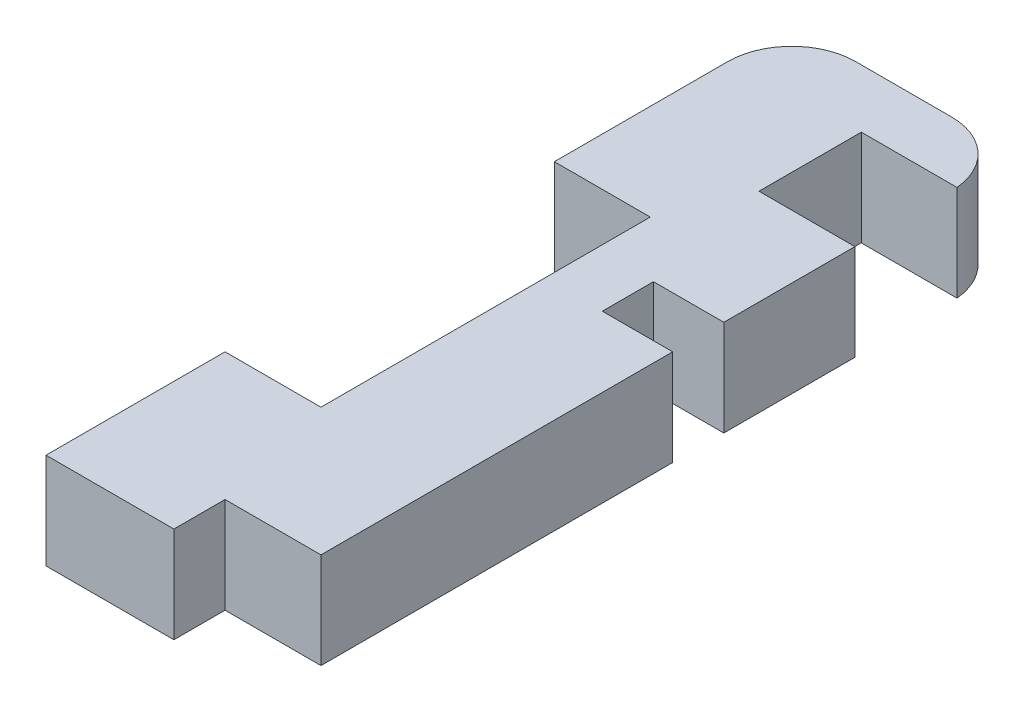
ISO-10303-21;
HEADER;
FILE_DESCRIPTION(('STEP AP214'),'2;1');
FILE_NAME('part.step','',(''),(''),'','','');
FILE_SCHEMA(('AUTOMOTIVE_DESIGN { 1 0 10303 214 1 1 1 1 }'));
ENDSEC;
DATA;
#1=APPLICATION_CONTEXT('core data for automotive mechanical design processes');
#2=APPLICATION_PROTOCOL_DEFINITION('international standard','automotive_design',2000,#1);
#3=PRODUCT_CONTEXT('',#1,'mechanical');
#4=PRODUCT('Part','Part','',(#3));
#5=PRODUCT_RELATED_PRODUCT_CATEGORY('part','',(#4));
#6=PRODUCT_DEFINITION_FORMATION('','',#4);
#7=PRODUCT_DEFINITION_CONTEXT('part definition',#1,'design');
#8=PRODUCT_DEFINITION('design','',#6,#7);
#9=PRODUCT_DEFINITION_SHAPE('','',#8);
#10=(LENGTH_UNIT() NAMED_UNIT(*) SI_UNIT(.MILLI.,.METRE.));
#11=(NAMED_UNIT(*) PLANE_ANGLE_UNIT() SI_UNIT($,.RADIAN.));
#12=(NAMED_UNIT(*) SI_UNIT($,.STERADIAN.) SOLID_ANGLE_UNIT());
#13=UNCERTAINTY_MEASURE_WITH_UNIT(LENGTH_MEASURE(1.E-05),#10,'distance_accuracy_value','');
#14=(GEOMETRIC_REPRESENTATION_CONTEXT(3) GLOBAL_UNCERTAINTY_ASSIGNED_CONTEXT((#13)) GLOBAL_UNIT_ASSIGNED_CONTEXT((#10,
#11,#12)) REPRESENTATION_CONTEXT('',''));
#15=CARTESIAN_POINT('',(0.,0.,0.));
#16=DIRECTION('',(0.,0.,1.));
#17=DIRECTION('',(1.,0.,0.));
#18=AXIS2_PLACEMENT_3D('',#15,#16,#17);
#19=CARTESIAN_POINT('',(-4.,24.3,-21.7231702245226));
#20=DIRECTION('',(1.,0.,0.));
#21=DIRECTION('',(0.,1.,0.));
#22=AXIS2_PLACEMENT_3D('',#19,#20,#21);
#23=PLANE('',#22);
#24=DIRECTION('',(0.,0.,1.));
#25=VECTOR('',#24,1.);
#26=CARTESIAN_POINT('',(-4.,21.3,-21.7231702245226));
#27=LINE('',#26,#25);
#28=CARTESIAN_POINT('',(-4.,21.3,-4.));
#29=VERTEX_POINT('',#28);
#30=CARTESIAN_POINT('',(-3.99999999999999,21.3,1.6));
#31=VERTEX_POINT('',#30);
#32=EDGE_CURVE('E248',#29,#31,#27,.T.);
#33=ORIENTED_EDGE('',*,*,#32,.T.);
#34=DIRECTION('',(0.,1.,0.));
#35=VECTOR('',#34,1.);
#36=CARTESIAN_POINT('',(-4.,-5.73160723649835,1.6));
#37=LINE('',#36,#35);
#38=CARTESIAN_POINT('',(-4.,24.3,1.6));
#39=VERTEX_POINT('',#38);
#40=EDGE_CURVE('E192',#31,#39,#37,.T.);
#41=ORIENTED_EDGE('',*,*,#40,.T.);
#42=DIRECTION('',(0.,0.,1.));
#43=VECTOR('',#42,1.);
#44=CARTESIAN_POINT('',(-4.,24.3,-21.7231702245226));
#45=LINE('',#44,#43);
#46=CARTESIAN_POINT('',(-4.,24.3,-4.));
#47=VERTEX_POINT('',#46);
#48=EDGE_CURVE('E227',#47,#39,#45,.T.);
#49=ORIENTED_EDGE('',*,*,#48,.F.);
#50=DIRECTION('',(0.,-1.,0.));
#51=VECTOR('',#50,1.);
#52=CARTESIAN_POINT('',(-4.,71.721,-4.));
#53=LINE('',#52,#51);
#54=EDGE_CURVE('E210',#47,#29,#53,.T.);
#55=ORIENTED_EDGE('',*,*,#54,.T.);
#56=EDGE_LOOP('',(#33,#41,#49,#55));
#57=FACE_BOUND('',#56,.T.);
#58=ADVANCED_FACE('F32',(#57),#23,.F.);
#59=CARTESIAN_POINT('',(0.,24.3,-16.8));
#60=DIRECTION('',(-1.,0.,0.));
#61=DIRECTION('',(0.,-1.,0.));
#62=AXIS2_PLACEMENT_3D('',#59,#60,#61);
#63=PLANE('',#62);
#64=DIRECTION('',(0.,0.,-1.));
#65=VECTOR('',#64,1.);
#66=CARTESIAN_POINT('',(0.,21.3,-16.8));
#67=LINE('',#66,#65);
#68=CARTESIAN_POINT('',(0.,21.3,-16.7));
#69=VERTEX_POINT('',#68);
#70=CARTESIAN_POINT('',(0.,21.3,-19.9));
#71=VERTEX_POINT('',#70);
#72=EDGE_CURVE('E47',#69,#71,#67,.T.);
#73=ORIENTED_EDGE('',*,*,#72,.T.);
#74=DIRECTION('',(0.,-1.,0.));
#75=VECTOR('',#74,1.);
#76=CARTESIAN_POINT('',(0.,72.14,-19.9));
#77=LINE('',#76,#75);
#78=CARTESIAN_POINT('',(0.,24.3,-19.9));
#79=VERTEX_POINT('',#78);
#80=EDGE_CURVE('E164',#79,#71,#77,.T.);
#81=ORIENTED_EDGE('',*,*,#80,.F.);
#82=DIRECTION('',(0.,0.,-1.));
#83=VECTOR('',#82,1.);
#84=CARTESIAN_POINT('',(0.,24.3,-16.8));
#85=LINE('',#84,#83);
#86=CARTESIAN_POINT('',(0.,24.3,-16.7));
#87=VERTEX_POINT('',#86);
#88=EDGE_CURVE('E221',#87,#79,#85,.T.);
#89=ORIENTED_EDGE('',*,*,#88,.F.);
#90=DIRECTION('',(0.,-1.,0.));
#91=VECTOR('',#90,1.);
#92=CARTESIAN_POINT('',(0.,72.14,-16.7));
#93=LINE('',#92,#91);
#94=EDGE_CURVE('E166',#87,#69,#93,.T.);
#95=ORIENTED_EDGE('',*,*,#94,.T.);
#96=EDGE_LOOP('',(#73,#81,#89,#95));
#97=FACE_BOUND('',#96,.T.);
#98=ADVANCED_FACE('F163',(#97),#63,.F.);
#99=CARTESIAN_POINT('',(3.,24.3,-21.7231702245226));
#100=DIRECTION('',(0.,0.,1.));
#101=DIRECTION('',(1.,0.,0.));
#102=AXIS2_PLACEMENT_3D('',#99,#100,#101);
#103=PLANE('',#102);
#104=DIRECTION('',(-1.,0.,0.));
#105=VECTOR('',#104,1.);
#106=CARTESIAN_POINT('',(3.,21.3,-21.7231702245226));
#107=LINE('',#106,#105);
#108=CARTESIAN_POINT('',(1.00147624842734,21.3,-21.7231702245226));
#109=VERTEX_POINT('',#108);
#110=CARTESIAN_POINT('',(-2.,21.3,-21.7231702245226));
#111=VERTEX_POINT('',#110);
#112=EDGE_CURVE('E167',#109,#111,#107,.T.);
#113=ORIENTED_EDGE('',*,*,#112,.T.);
#114=DIRECTION('',(0.,-1.,0.));
#115=VECTOR('',#114,1.);
#116=CARTESIAN_POINT('',(-2.,24.3,-21.7231702245226));
#117=LINE('',#116,#115);
#118=CARTESIAN_POINT('',(-2.,24.3,-21.7231702245226));
#119=VERTEX_POINT('',#118);
#120=EDGE_CURVE('E296',#111,#119,#117,.F.);
#121=ORIENTED_EDGE('',*,*,#120,.T.);
#122=DIRECTION('',(-1.,0.,0.));
#123=VECTOR('',#122,1.);
#124=CARTESIAN_POINT('',(3.,24.3,-21.7231702245226));
#125=LINE('',#124,#123);
#126=CARTESIAN_POINT('',(1.00147624842734,24.3,-21.7231702245226));
#127=VERTEX_POINT('',#126);
#128=EDGE_CURVE('E223',#127,#119,#125,.T.);
#129=ORIENTED_EDGE('',*,*,#128,.F.);
#130=DIRECTION('',(0.,-1.,0.));
#131=VECTOR('',#130,1.);
#132=CARTESIAN_POINT('',(1.00147624842734,24.3,-21.7231702245226));
#133=LINE('',#132,#131);
#134=EDGE_CURVE('E293',#127,#109,#133,.T.);
#135=ORIENTED_EDGE('',*,*,#134,.T.);
#136=EDGE_LOOP('',(#113,#121,#129,#135));
#137=FACE_BOUND('',#136,.T.);
#138=ADVANCED_FACE('F315',(#137),#103,.F.);
#139=CARTESIAN_POINT('',(-4.,24.3,-19.7231702245226));
#140=VERTEX_POINT('',#139);
#141=CARTESIAN_POINT('',(-4.,24.3,-14.3));
#142=VERTEX_POINT('',#141);
#143=EDGE_CURVE('E228',#140,#142,#45,.T.);
#144=ORIENTED_EDGE('',*,*,#143,.F.);
#145=DIRECTION('',(0.,-1.,0.));
#146=VECTOR('',#145,1.);
#147=CARTESIAN_POINT('',(-4.,24.3,-19.7231702245226));
#148=LINE('',#147,#146);
#149=CARTESIAN_POINT('',(-4.,21.3,-19.7231702245226));
#150=VERTEX_POINT('',#149);
#151=EDGE_CURVE('E287',#140,#150,#148,.T.);
#152=ORIENTED_EDGE('',*,*,#151,.T.);
#153=CARTESIAN_POINT('',(-4.,21.3,-14.3));
#154=VERTEX_POINT('',#153);
#155=EDGE_CURVE('E249',#150,#154,#27,.T.);
#156=ORIENTED_EDGE('',*,*,#155,.T.);
#157=DIRECTION('',(0.,-1.,0.));
#158=VECTOR('',#157,1.);
#159=CARTESIAN_POINT('',(-4.,71.721,-14.3));
#160=LINE('',#159,#158);
#161=EDGE_CURVE('E209',#142,#154,#160,.T.);
#162=ORIENTED_EDGE('',*,*,#161,.F.);
#163=EDGE_LOOP('',(#144,#152,#156,#162));
#164=FACE_BOUND('',#163,.T.);
#165=ADVANCED_FACE('F310',(#164),#23,.F.);
#166=CARTESIAN_POINT('',(0.,24.3,1.6));
#167=DIRECTION('',(-1.,0.,0.));
#168=DIRECTION('',(0.,-1.,0.));
#169=AXIS2_PLACEMENT_3D('',#166,#167,#168);
#170=PLANE('',#169);
#171=DIRECTION('',(0.,0.,-1.));
#172=VECTOR('',#171,1.);
#173=CARTESIAN_POINT('',(0.,21.3,1.6));
#174=LINE('',#173,#172);
#175=CARTESIAN_POINT('',(0.,21.3,1.6));
#176=VERTEX_POINT('',#175);
#177=CARTESIAN_POINT('',(0.,21.3,0.));
#178=VERTEX_POINT('',#177);
#179=EDGE_CURVE('E251',#176,#178,#174,.T.);
#180=ORIENTED_EDGE('',*,*,#179,.T.);
#181=DIRECTION('',(0.,-1.,0.));
#182=VECTOR('',#181,1.);
#183=CARTESIAN_POINT('',(0.,24.3,0.));
#184=LINE('',#183,#182);
#185=CARTESIAN_POINT('',(0.,24.3,0.));
#186=VERTEX_POINT('',#185);
#187=EDGE_CURVE('E279',#186,#178,#184,.T.);
#188=ORIENTED_EDGE('',*,*,#187,.F.);
#189=DIRECTION('',(0.,0.,-1.));
#190=VECTOR('',#189,1.);
#191=CARTESIAN_POINT('',(0.,24.3,1.6));
#192=LINE('',#191,#190);
#193=CARTESIAN_POINT('',(0.,24.3,1.6));
#194=VERTEX_POINT('',#193);
#195=EDGE_CURVE('E230',#194,#186,#192,.T.);
#196=ORIENTED_EDGE('',*,*,#195,.F.);
#197=DIRECTION('',(0.,-1.,0.));
#198=VECTOR('',#197,1.);
#199=CARTESIAN_POINT('',(0.,24.3,1.6));
#200=LINE('',#199,#198);
#201=EDGE_CURVE('E282',#194,#176,#200,.T.);
#202=ORIENTED_EDGE('',*,*,#201,.T.);
#203=EDGE_LOOP('',(#180,#188,#196,#202));
#204=FACE_BOUND('',#203,.T.);
#205=ADVANCED_FACE('F356',(#204),#170,.F.);
#206=CARTESIAN_POINT('',(3.00000000000001,24.3,0.));
#207=DIRECTION('',(0.,0.,-1.));
#208=DIRECTION('',(-1.,0.,0.));
#209=AXIS2_PLACEMENT_3D('',#206,#207,#208);
#210=PLANE('',#209);
#211=DIRECTION('',(1.,0.,0.));
#212=VECTOR('',#211,1.);
#213=CARTESIAN_POINT('',(3.00000000000001,21.3,0.));
#214=LINE('',#213,#212);
#215=CARTESIAN_POINT('',(3.00000000000001,21.3,0.));
#216=VERTEX_POINT('',#215);
#217=EDGE_CURVE('E253',#178,#216,#214,.T.);
#218=ORIENTED_EDGE('',*,*,#217,.T.);
#219=DIRECTION('',(0.,-1.,0.));
#220=VECTOR('',#219,1.);
#221=CARTESIAN_POINT('',(3.00000000000001,24.3,0.));
#222=LINE('',#221,#220);
#223=CARTESIAN_POINT('',(3.00000000000001,24.3,0.));
#224=VERTEX_POINT('',#223);
#225=EDGE_CURVE('E276',#224,#216,#222,.T.);
#226=ORIENTED_EDGE('',*,*,#225,.F.);
#227=DIRECTION('',(1.,0.,0.));
#228=VECTOR('',#227,1.);
#229=CARTESIAN_POINT('',(3.00000000000001,24.3,0.));
#230=LINE('',#229,#228);
#231=EDGE_CURVE('E232',#186,#224,#230,.T.);
#232=ORIENTED_EDGE('',*,*,#231,.F.);
#233=ORIENTED_EDGE('',*,*,#187,.T.);
#234=EDGE_LOOP('',(#218,#226,#232,#233));
#235=FACE_BOUND('',#234,.T.);
#236=ADVANCED_FACE('F351',(#235),#210,.F.);
#237=CARTESIAN_POINT('',(3.,24.3,-11.));
#238=DIRECTION('',(-1.,0.,0.));
#239=DIRECTION('',(0.,-1.,0.));
#240=AXIS2_PLACEMENT_3D('',#237,#238,#239);
#241=PLANE('',#240);
#242=DIRECTION('',(0.,0.,-1.));
#243=VECTOR('',#242,1.);
#244=CARTESIAN_POINT('',(3.,21.3,-11.));
#245=LINE('',#244,#243);
#246=CARTESIAN_POINT('',(3.,21.3,-11.));
#247=VERTEX_POINT('',#246);
#248=EDGE_CURVE('E255',#216,#247,#245,.T.);
#249=ORIENTED_EDGE('',*,*,#248,.T.);
#250=DIRECTION('',(0.,-1.,0.));
#251=VECTOR('',#250,1.);
#252=CARTESIAN_POINT('',(3.,24.3,-11.));
#253=LINE('',#252,#251);
#254=CARTESIAN_POINT('',(3.,24.3,-11.));
#255=VERTEX_POINT('',#254);
#256=EDGE_CURVE('E273',#255,#247,#253,.T.);
#257=ORIENTED_EDGE('',*,*,#256,.F.);
#258=DIRECTION('',(0.,0.,-1.));
#259=VECTOR('',#258,1.);
#260=CARTESIAN_POINT('',(3.,24.3,-11.));
#261=LINE('',#260,#259);
#262=EDGE_CURVE('E234',#224,#255,#261,.T.);
#263=ORIENTED_EDGE('',*,*,#262,.F.);
#264=ORIENTED_EDGE('',*,*,#225,.T.);
#265=EDGE_LOOP('',(#249,#257,#263,#264));
#266=FACE_BOUND('',#265,.T.);
#267=ADVANCED_FACE('F345',(#266),#241,.F.);
#268=CARTESIAN_POINT('',(0.799999999999996,24.3,-11.));
#269=DIRECTION('',(0.,0.,1.));
#270=DIRECTION('',(1.,0.,0.));
#271=AXIS2_PLACEMENT_3D('',#268,#269,#270);
#272=PLANE('',#271);
#273=DIRECTION('',(-1.,0.,0.));
#274=VECTOR('',#273,1.);
#275=CARTESIAN_POINT('',(0.799999999999995,21.3,-11.));
#276=LINE('',#275,#274);
#277=CARTESIAN_POINT('',(0.799999999999995,21.3,-11.));
#278=VERTEX_POINT('',#277);
#279=EDGE_CURVE('E257',#247,#278,#276,.T.);
#280=ORIENTED_EDGE('',*,*,#279,.T.);
#281=DIRECTION('',(0.,-1.,0.));
#282=VECTOR('',#281,1.);
#283=CARTESIAN_POINT('',(0.799999999999996,24.3,-11.));
#284=LINE('',#283,#282);
#285=CARTESIAN_POINT('',(0.799999999999996,24.3,-11.));
#286=VERTEX_POINT('',#285);
#287=EDGE_CURVE('E270',#286,#278,#284,.T.);
#288=ORIENTED_EDGE('',*,*,#287,.F.);
#289=DIRECTION('',(-1.,0.,0.));
#290=VECTOR('',#289,1.);
#291=CARTESIAN_POINT('',(0.799999999999996,24.3,-11.));
#292=LINE('',#291,#290);
#293=EDGE_CURVE('E236',#255,#286,#292,.T.);
#294=ORIENTED_EDGE('',*,*,#293,.F.);
#295=ORIENTED_EDGE('',*,*,#256,.T.);
#296=EDGE_LOOP('',(#280,#288,#294,#295));
#297=FACE_BOUND('',#296,.T.);
#298=ADVANCED_FACE('F341',(#297),#272,.F.);
#299=CARTESIAN_POINT('',(0.799999999999996,24.3,-11.));
#300=DIRECTION('',(-1.,0.,0.));
#301=DIRECTION('',(0.,-1.,0.));
#302=AXIS2_PLACEMENT_3D('',#299,#300,#301);
#303=PLANE('',#302);
#304=DIRECTION('',(0.,0.,-1.));
#305=VECTOR('',#304,1.);
#306=CARTESIAN_POINT('',(0.799999999999995,21.3,-11.));
#307=LINE('',#306,#305);
#308=CARTESIAN_POINT('',(0.799999999999995,21.3,-12.6));
#309=VERTEX_POINT('',#308);
#310=EDGE_CURVE('E259',#278,#309,#307,.T.);
#311=ORIENTED_EDGE('',*,*,#310,.T.);
#312=DIRECTION('',(0.,-1.,0.));
#313=VECTOR('',#312,1.);
#314=CARTESIAN_POINT('',(0.799999999999996,24.3,-12.6));
#315=LINE('',#314,#313);
#316=CARTESIAN_POINT('',(0.799999999999996,24.3,-12.6));
#317=VERTEX_POINT('',#316);
#318=EDGE_CURVE('E267',#317,#309,#315,.T.);
#319=ORIENTED_EDGE('',*,*,#318,.F.);
#320=DIRECTION('',(0.,0.,-1.));
#321=VECTOR('',#320,1.);
#322=CARTESIAN_POINT('',(0.799999999999996,24.3,-11.));
#323=LINE('',#322,#321);
#324=EDGE_CURVE('E238',#286,#317,#323,.T.);
#325=ORIENTED_EDGE('',*,*,#324,.F.);
#326=ORIENTED_EDGE('',*,*,#287,.T.);
#327=EDGE_LOOP('',(#311,#319,#325,#326));
#328=FACE_BOUND('',#327,.T.);
#329=ADVANCED_FACE('F336',(#328),#303,.F.);
#330=CARTESIAN_POINT('',(3.,24.3,-12.6));
#331=DIRECTION('',(0.,0.,-1.));
#332=DIRECTION('',(-1.,0.,0.));
#333=AXIS2_PLACEMENT_3D('',#330,#331,#332);
#334=PLANE('',#333);
#335=DIRECTION('',(1.,0.,0.));
#336=VECTOR('',#335,1.);
#337=CARTESIAN_POINT('',(3.,21.3,-12.6));
#338=LINE('',#337,#336);
#339=CARTESIAN_POINT('',(3.,21.3,-12.6));
#340=VERTEX_POINT('',#339);
#341=EDGE_CURVE('E261',#309,#340,#338,.T.);
#342=ORIENTED_EDGE('',*,*,#341,.T.);
#343=DIRECTION('',(0.,-1.,0.));
#344=VECTOR('',#343,1.);
#345=CARTESIAN_POINT('',(3.,24.3,-12.6));
#346=LINE('',#345,#344);
#347=CARTESIAN_POINT('',(3.,24.3,-12.6));
#348=VERTEX_POINT('',#347);
#349=EDGE_CURVE('E244',#348,#340,#346,.T.);
#350=ORIENTED_EDGE('',*,*,#349,.F.);
#351=DIRECTION('',(1.,0.,0.));
#352=VECTOR('',#351,1.);
#353=CARTESIAN_POINT('',(3.,24.3,-12.6));
#354=LINE('',#353,#352);
#355=EDGE_CURVE('E240',#317,#348,#354,.T.);
#356=ORIENTED_EDGE('',*,*,#355,.F.);
#357=ORIENTED_EDGE('',*,*,#318,.T.);
#358=EDGE_LOOP('',(#342,#350,#356,#357));
#359=FACE_BOUND('',#358,.T.);
#360=ADVANCED_FACE('F330',(#359),#334,.F.);
#361=CARTESIAN_POINT('',(3.,24.3,-16.8));
#362=DIRECTION('',(-1.,0.,0.));
#363=DIRECTION('',(0.,-1.,0.));
#364=AXIS2_PLACEMENT_3D('',#361,#362,#363);
#365=PLANE('',#364);
#366=DIRECTION('',(0.,0.,-1.));
#367=VECTOR('',#366,1.);
#368=CARTESIAN_POINT('',(3.,21.3,-16.8));
#369=LINE('',#368,#367);
#370=CARTESIAN_POINT('',(3.,21.3,-16.7));
#371=VERTEX_POINT('',#370);
#372=EDGE_CURVE('E224',#340,#371,#369,.T.);
#373=ORIENTED_EDGE('',*,*,#372,.T.);
#374=DIRECTION('',(0.,-1.,0.));
#375=VECTOR('',#374,1.);
#376=CARTESIAN_POINT('',(3.,72.14,-16.7));
#377=LINE('',#376,#375);
#378=CARTESIAN_POINT('',(3.,24.3,-16.7));
#379=VERTEX_POINT('',#378);
#380=EDGE_CURVE('E174',#379,#371,#377,.T.);
#381=ORIENTED_EDGE('',*,*,#380,.F.);
#382=DIRECTION('',(0.,0.,-1.));
#383=VECTOR('',#382,1.);
#384=CARTESIAN_POINT('',(3.,24.3,-16.8));
#385=LINE('',#384,#383);
#386=EDGE_CURVE('E242',#348,#379,#385,.T.);
#387=ORIENTED_EDGE('',*,*,#386,.F.);
#388=ORIENTED_EDGE('',*,*,#349,.T.);
#389=EDGE_LOOP('',(#373,#381,#387,#388));
#390=FACE_BOUND('',#389,.T.);
#391=ADVANCED_FACE('F325',(#390),#365,.F.);
#392=CARTESIAN_POINT('',(0.,24.3,0.));
#393=DIRECTION('',(0.,-1.,0.));
#394=DIRECTION('',(0.,0.,-1.));
#395=AXIS2_PLACEMENT_3D('',#392,#393,#394);
#396=PLANE('',#395);
#397=ORIENTED_EDGE('',*,*,#386,.T.);
#398=DIRECTION('',(-1.,0.,0.));
#399=VECTOR('',#398,1.);
#400=CARTESIAN_POINT('',(0.,24.3,-16.7));
#401=LINE('',#400,#399);
#402=EDGE_CURVE('E187',#379,#87,#401,.T.);
#403=ORIENTED_EDGE('',*,*,#402,.T.);
#404=ORIENTED_EDGE('',*,*,#88,.T.);
#405=DIRECTION('',(1.,0.,0.));
#406=VECTOR('',#405,1.);
#407=CARTESIAN_POINT('',(0.,24.3,-19.9));
#408=LINE('',#407,#406);
#409=CARTESIAN_POINT('',(2.99364371892388,24.3,-19.9));
#410=VERTEX_POINT('',#409);
#411=EDGE_CURVE('E173',#79,#410,#408,.T.);
#412=ORIENTED_EDGE('',*,*,#411,.T.);
#413=CARTESIAN_POINT('',(1.00147624842734,24.3,-19.7231702245226));
#414=DIRECTION('',(0.,-1.,0.));
#415=DIRECTION('',(0.,0.,-1.));
#416=AXIS2_PLACEMENT_3D('',#413,#414,#415);
#417=CIRCLE('',#416,2.);
#418=EDGE_CURVE('E298',#410,#127,#417,.F.);
#419=ORIENTED_EDGE('',*,*,#418,.T.);
#420=ORIENTED_EDGE('',*,*,#128,.T.);
#421=CARTESIAN_POINT('',(-2.,24.3,-19.7231702245226));
#422=DIRECTION('',(0.,-1.,0.));
#423=DIRECTION('',(0.,0.,-1.));
#424=AXIS2_PLACEMENT_3D('',#421,#422,#423);
#425=CIRCLE('',#424,2.);
#426=EDGE_CURVE('E40',#119,#140,#425,.F.);
#427=ORIENTED_EDGE('',*,*,#426,.T.);
#428=ORIENTED_EDGE('',*,*,#143,.T.);
#429=DIRECTION('',(-1.,0.,0.));
#430=VECTOR('',#429,1.);
#431=CARTESIAN_POINT('',(-4.,24.3,-14.3));
#432=LINE('',#431,#430);
#433=CARTESIAN_POINT('',(-0.999999999999997,24.3,-14.3));
#434=VERTEX_POINT('',#433);
#435=EDGE_CURVE('E168',#434,#142,#432,.T.);
#436=ORIENTED_EDGE('',*,*,#435,.F.);
#437=DIRECTION('',(0.,0.,-1.));
#438=VECTOR('',#437,1.);
#439=CARTESIAN_POINT('',(-0.999999999999997,24.3,-14.3));
#440=LINE('',#439,#438);
#441=CARTESIAN_POINT('',(-0.999999999999997,24.3,-4.));
#442=VERTEX_POINT('',#441);
#443=EDGE_CURVE('E195',#442,#434,#440,.T.);
#444=ORIENTED_EDGE('',*,*,#443,.F.);
#445=DIRECTION('',(1.,0.,0.));
#446=VECTOR('',#445,1.);
#447=CARTESIAN_POINT('',(-4.,24.3,-4.));
#448=LINE('',#447,#446);
#449=EDGE_CURVE('E198',#47,#442,#448,.T.);
#450=ORIENTED_EDGE('',*,*,#449,.F.);
#451=ORIENTED_EDGE('',*,*,#48,.T.);
#452=DIRECTION('',(-1.,0.,0.));
#453=VECTOR('',#452,1.);
#454=CARTESIAN_POINT('',(0.,24.3,1.6));
#455=LINE('',#454,#453);
#456=EDGE_CURVE('E190',#194,#39,#455,.T.);
#457=ORIENTED_EDGE('',*,*,#456,.F.);
#458=ORIENTED_EDGE('',*,*,#195,.T.);
#459=ORIENTED_EDGE('',*,*,#231,.T.);
#460=ORIENTED_EDGE('',*,*,#262,.T.);
#461=ORIENTED_EDGE('',*,*,#293,.T.);
#462=ORIENTED_EDGE('',*,*,#324,.T.);
#463=ORIENTED_EDGE('',*,*,#355,.T.);
#464=EDGE_LOOP('',(#397,#403,#404,#412,#419,#420,#427,#428,#436,#444,#450,#451,#457,#458,#459,
#460,#461,#462,#463));
#465=FACE_BOUND('',#464,.T.);
#466=ADVANCED_FACE('F302',(#465),#396,.F.);
#467=CARTESIAN_POINT('',(0.,21.3,0.));
#468=DIRECTION('',(0.,-1.,0.));
#469=DIRECTION('',(0.,0.,-1.));
#470=AXIS2_PLACEMENT_3D('',#467,#468,#469);
#471=PLANE('',#470);
#472=DIRECTION('',(-1.,0.,0.));
#473=VECTOR('',#472,1.);
#474=CARTESIAN_POINT('',(3.,21.3,-16.7));
#475=LINE('',#474,#473);
#476=EDGE_CURVE('E180',#371,#69,#475,.T.);
#477=ORIENTED_EDGE('',*,*,#476,.F.);
#478=ORIENTED_EDGE('',*,*,#372,.F.);
#479=ORIENTED_EDGE('',*,*,#341,.F.);
#480=ORIENTED_EDGE('',*,*,#310,.F.);
#481=ORIENTED_EDGE('',*,*,#279,.F.);
#482=ORIENTED_EDGE('',*,*,#248,.F.);
#483=ORIENTED_EDGE('',*,*,#217,.F.);
#484=ORIENTED_EDGE('',*,*,#179,.F.);
#485=DIRECTION('',(1.,0.,0.));
#486=VECTOR('',#485,1.);
#487=CARTESIAN_POINT('',(0.,21.3,1.6));
#488=LINE('',#487,#486);
#489=EDGE_CURVE('E285',#31,#176,#488,.T.);
#490=ORIENTED_EDGE('',*,*,#489,.F.);
#491=ORIENTED_EDGE('',*,*,#32,.F.);
#492=DIRECTION('',(-1.,0.,0.));
#493=VECTOR('',#492,1.);
#494=CARTESIAN_POINT('',(-4.,21.3,-4.));
#495=LINE('',#494,#493);
#496=CARTESIAN_POINT('',(-0.999999999999997,21.3,-4.));
#497=VERTEX_POINT('',#496);
#498=EDGE_CURVE('E207',#497,#29,#495,.T.);
#499=ORIENTED_EDGE('',*,*,#498,.F.);
#500=DIRECTION('',(0.,0.,1.));
#501=VECTOR('',#500,1.);
#502=CARTESIAN_POINT('',(-0.999999999999997,21.3,-14.3));
#503=LINE('',#502,#501);
#504=CARTESIAN_POINT('',(-0.999999999999997,21.3,-14.3));
#505=VERTEX_POINT('',#504);
#506=EDGE_CURVE('E204',#505,#497,#503,.T.);
#507=ORIENTED_EDGE('',*,*,#506,.F.);
#508=DIRECTION('',(1.,0.,0.));
#509=VECTOR('',#508,1.);
#510=CARTESIAN_POINT('',(-4.,21.3,-14.3));
#511=LINE('',#510,#509);
#512=EDGE_CURVE('E201',#154,#505,#511,.T.);
#513=ORIENTED_EDGE('',*,*,#512,.F.);
#514=ORIENTED_EDGE('',*,*,#155,.F.);
#515=CARTESIAN_POINT('',(-2.,21.3,-19.7231702245226));
#516=DIRECTION('',(0.,-1.,0.));
#517=DIRECTION('',(0.,0.,-1.));
#518=AXIS2_PLACEMENT_3D('',#515,#516,#517);
#519=CIRCLE('',#518,2.);
#520=EDGE_CURVE('E291',#150,#111,#519,.T.);
#521=ORIENTED_EDGE('',*,*,#520,.T.);
#522=ORIENTED_EDGE('',*,*,#112,.F.);
#523=CARTESIAN_POINT('',(1.00147624842734,21.3,-19.7231702245226));
#524=DIRECTION('',(0.,-1.,0.));
#525=DIRECTION('',(0.,0.,-1.));
#526=AXIS2_PLACEMENT_3D('',#523,#524,#525);
#527=CIRCLE('',#526,2.);
#528=CARTESIAN_POINT('',(2.99364371892388,21.3,-19.9));
#529=VERTEX_POINT('',#528);
#530=EDGE_CURVE('E179',#109,#529,#527,.T.);
#531=ORIENTED_EDGE('',*,*,#530,.T.);
#532=DIRECTION('',(1.,0.,0.));
#533=VECTOR('',#532,1.);
#534=CARTESIAN_POINT('',(0.,21.3,-19.9));
#535=LINE('',#534,#533);
#536=EDGE_CURVE('E53',#71,#529,#535,.T.);
#537=ORIENTED_EDGE('',*,*,#536,.F.);
#538=ORIENTED_EDGE('',*,*,#72,.F.);
#539=EDGE_LOOP('',(#477,#478,#479,#480,#481,#482,#483,#484,#490,#491,#499,#507,#513,#514,#521,
#522,#531,#537,#538));
#540=FACE_BOUND('',#539,.T.);
#541=ADVANCED_FACE('F177',(#540),#471,.T.);
#542=CARTESIAN_POINT('',(-4.,71.721,-4.));
#543=DIRECTION('',(0.,0.,1.));
#544=DIRECTION('',(1.,0.,0.));
#545=AXIS2_PLACEMENT_3D('',#542,#543,#544);
#546=PLANE('',#545);
#547=ORIENTED_EDGE('',*,*,#449,.T.);
#548=DIRECTION('',(0.,-1.,0.));
#549=VECTOR('',#548,1.);
#550=CARTESIAN_POINT('',(-0.999999999999997,71.721,-4.));
#551=LINE('',#550,#549);
#552=EDGE_CURVE('E213',#442,#497,#551,.T.);
#553=ORIENTED_EDGE('',*,*,#552,.T.);
#554=ORIENTED_EDGE('',*,*,#498,.T.);
#555=ORIENTED_EDGE('',*,*,#54,.F.);
#556=EDGE_LOOP('',(#547,#553,#554,#555));
#557=FACE_BOUND('',#556,.T.);
#558=ADVANCED_FACE('F370',(#557),#546,.F.);
#559=CARTESIAN_POINT('',(-0.999999999999997,71.721,-14.3));
#560=DIRECTION('',(1.,0.,0.));
#561=DIRECTION('',(0.,0.,-1.));
#562=AXIS2_PLACEMENT_3D('',#559,#560,#561);
#563=PLANE('',#562);
#564=ORIENTED_EDGE('',*,*,#443,.T.);
#565=DIRECTION('',(0.,-1.,0.));
#566=VECTOR('',#565,1.);
#567=CARTESIAN_POINT('',(-0.999999999999997,71.721,-14.3));
#568=LINE('',#567,#566);
#569=EDGE_CURVE('E215',#434,#505,#568,.T.);
#570=ORIENTED_EDGE('',*,*,#569,.T.);
#571=ORIENTED_EDGE('',*,*,#506,.T.);
#572=ORIENTED_EDGE('',*,*,#552,.F.);
#573=EDGE_LOOP('',(#564,#570,#571,#572));
#574=FACE_BOUND('',#573,.T.);
#575=ADVANCED_FACE('F372',(#574),#563,.F.);
#576=CARTESIAN_POINT('',(-4.,71.721,-14.3));
#577=DIRECTION('',(0.,0.,-1.));
#578=DIRECTION('',(-1.,0.,0.));
#579=AXIS2_PLACEMENT_3D('',#576,#577,#578);
#580=PLANE('',#579);
#581=ORIENTED_EDGE('',*,*,#435,.T.);
#582=ORIENTED_EDGE('',*,*,#161,.T.);
#583=ORIENTED_EDGE('',*,*,#512,.T.);
#584=ORIENTED_EDGE('',*,*,#569,.F.);
#585=EDGE_LOOP('',(#581,#582,#583,#584));
#586=FACE_BOUND('',#585,.T.);
#587=ADVANCED_FACE('F374',(#586),#580,.F.);
#588=CARTESIAN_POINT('',(0.,-5.73160723649835,1.6));
#589=DIRECTION('',(0.,0.,-1.));
#590=DIRECTION('',(-1.,0.,0.));
#591=AXIS2_PLACEMENT_3D('',#588,#589,#590);
#592=PLANE('',#591);
#593=ORIENTED_EDGE('',*,*,#456,.T.);
#594=ORIENTED_EDGE('',*,*,#40,.F.);
#595=ORIENTED_EDGE('',*,*,#489,.T.);
#596=ORIENTED_EDGE('',*,*,#201,.F.);
#597=EDGE_LOOP('',(#593,#594,#595,#596));
#598=FACE_BOUND('',#597,.T.);
#599=ADVANCED_FACE('F359',(#598),#592,.F.);
#600=CARTESIAN_POINT('',(-2.,24.3,-19.7231702245226));
#601=DIRECTION('',(0.,-1.,0.));
#602=DIRECTION('',(1.,0.,0.));
#603=AXIS2_PLACEMENT_3D('',#600,#601,#602);
#604=CYLINDRICAL_SURFACE('',#603,2.);
#605=ORIENTED_EDGE('',*,*,#426,.F.);
#606=ORIENTED_EDGE('',*,*,#120,.F.);
#607=ORIENTED_EDGE('',*,*,#520,.F.);
#608=ORIENTED_EDGE('',*,*,#151,.F.);
#609=EDGE_LOOP('',(#605,#606,#607,#608));
#610=FACE_BOUND('',#609,.T.);
#611=ADVANCED_FACE('F312',(#610),#604,.T.);
#612=CARTESIAN_POINT('',(1.00147624842734,24.3,-19.7231702245226));
#613=DIRECTION('',(0.,-1.,0.));
#614=DIRECTION('',(1.,0.,0.));
#615=AXIS2_PLACEMENT_3D('',#612,#613,#614);
#616=CYLINDRICAL_SURFACE('',#615,2.);
#617=DIRECTION('',(0.,-1.,0.));
#618=VECTOR('',#617,1.);
#619=CARTESIAN_POINT('',(2.99364371892388,24.3,-19.9));
#620=LINE('',#619,#618);
#621=EDGE_CURVE('E11',#529,#410,#620,.F.);
#622=ORIENTED_EDGE('',*,*,#621,.F.);
#623=ORIENTED_EDGE('',*,*,#530,.F.);
#624=ORIENTED_EDGE('',*,*,#134,.F.);
#625=ORIENTED_EDGE('',*,*,#418,.F.);
#626=EDGE_LOOP('',(#622,#623,#624,#625));
#627=FACE_BOUND('',#626,.T.);
#628=ADVANCED_FACE('F34',(#627),#616,.T.);
#629=CARTESIAN_POINT('',(0.,72.14,-19.9));
#630=DIRECTION('',(0.,0.,-1.));
#631=DIRECTION('',(-1.,0.,0.));
#632=AXIS2_PLACEMENT_3D('',#629,#630,#631);
#633=PLANE('',#632);
#634=ORIENTED_EDGE('',*,*,#80,.T.);
#635=ORIENTED_EDGE('',*,*,#536,.T.);
#636=ORIENTED_EDGE('',*,*,#621,.T.);
#637=ORIENTED_EDGE('',*,*,#411,.F.);
#638=EDGE_LOOP('',(#634,#635,#636,#637));
#639=FACE_BOUND('',#638,.T.);
#640=ADVANCED_FACE('F171',(#639),#633,.F.);
#641=CARTESIAN_POINT('',(3.,72.14,-16.7));
#642=DIRECTION('',(0.,0.,1.));
#643=DIRECTION('',(1.,0.,0.));
#644=AXIS2_PLACEMENT_3D('',#641,#642,#643);
#645=PLANE('',#644);
#646=ORIENTED_EDGE('',*,*,#380,.T.);
#647=ORIENTED_EDGE('',*,*,#476,.T.);
#648=ORIENTED_EDGE('',*,*,#94,.F.);
#649=ORIENTED_EDGE('',*,*,#402,.F.);
#650=EDGE_LOOP('',(#646,#647,#648,#649));
#651=FACE_BOUND('',#650,.T.);
#652=ADVANCED_FACE('F320',(#651),#645,.F.);
#653=CLOSED_SHELL('',(#58,#98,#138,#165,#205,#236,#267,#298,#329,#360,#391,#466,#541,#558,#575,
#587,#599,#611,#628,#640,#652));
#654=MANIFOLD_SOLID_BREP('B2',#653);
#655=ADVANCED_BREP_SHAPE_REPRESENTATION('',(#18,#654),#14);
#656=SHAPE_DEFINITION_REPRESENTATION(#9,#655);
ENDSEC;
END-ISO-10303-21;
